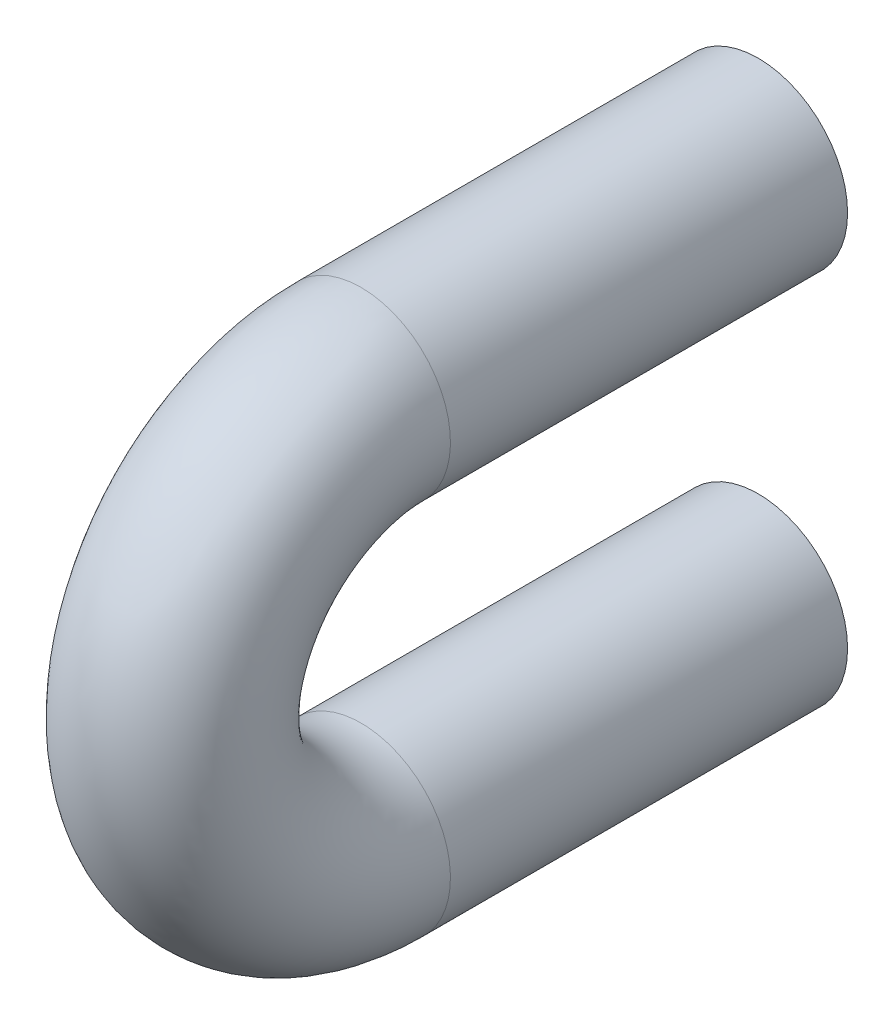
ISO-10303-21;
HEADER;
FILE_DESCRIPTION(('STEP AP214'),'2;1');
FILE_NAME('part.step','',(''),(''),'','','');
FILE_SCHEMA(('AUTOMOTIVE_DESIGN { 1 0 10303 214 1 1 1 1 }'));
ENDSEC;
DATA;
#1=APPLICATION_CONTEXT('core data for automotive mechanical design processes');
#2=APPLICATION_PROTOCOL_DEFINITION('international standard','automotive_design',2000,#1);
#3=PRODUCT_CONTEXT('',#1,'mechanical');
#4=PRODUCT('Part','Part','',(#3));
#5=PRODUCT_RELATED_PRODUCT_CATEGORY('part','',(#4));
#6=PRODUCT_DEFINITION_FORMATION('','',#4);
#7=PRODUCT_DEFINITION_CONTEXT('part definition',#1,'design');
#8=PRODUCT_DEFINITION('design','',#6,#7);
#9=PRODUCT_DEFINITION_SHAPE('','',#8);
#10=(LENGTH_UNIT() NAMED_UNIT(*) SI_UNIT(.MILLI.,.METRE.));
#11=(NAMED_UNIT(*) PLANE_ANGLE_UNIT() SI_UNIT($,.RADIAN.));
#12=(NAMED_UNIT(*) SI_UNIT($,.STERADIAN.) SOLID_ANGLE_UNIT());
#13=UNCERTAINTY_MEASURE_WITH_UNIT(LENGTH_MEASURE(1.E-05),#10,'distance_accuracy_value','');
#14=(GEOMETRIC_REPRESENTATION_CONTEXT(3) GLOBAL_UNCERTAINTY_ASSIGNED_CONTEXT((#13)) GLOBAL_UNIT_ASSIGNED_CONTEXT((#10,
#11,#12)) REPRESENTATION_CONTEXT('',''));
#15=CARTESIAN_POINT('',(0.,0.,0.));
#16=DIRECTION('',(0.,0.,1.));
#17=DIRECTION('',(1.,0.,0.));
#18=AXIS2_PLACEMENT_3D('',#15,#16,#17);
#19=CARTESIAN_POINT('',(0.,19.,20.));
#20=DIRECTION('',(0.,0.,-1.));
#21=DIRECTION('',(-1.,0.,0.));
#22=AXIS2_PLACEMENT_3D('',#19,#20,#21);
#23=CYLINDRICAL_SURFACE('',#22,4.5);
#24=CARTESIAN_POINT('',(0.,19.,20.));
#25=DIRECTION('',(0.,0.,-1.));
#26=DIRECTION('',(1.,0.,0.));
#27=AXIS2_PLACEMENT_3D('',#24,#25,#26);
#28=CIRCLE('',#27,4.5);
#29=CARTESIAN_POINT('',(0.,23.5,20.));
#30=VERTEX_POINT('',#29);
#31=EDGE_CURVE('E37',#30,#30,#28,.T.);
#32=ORIENTED_EDGE('',*,*,#31,.T.);
#33=EDGE_LOOP('',(#32));
#34=FACE_BOUND('',#33,.T.);
#35=CARTESIAN_POINT('',(0.,19.,0.));
#36=DIRECTION('',(0.,0.,-1.));
#37=DIRECTION('',(1.,0.,0.));
#38=AXIS2_PLACEMENT_3D('',#35,#36,#37);
#39=CIRCLE('',#38,4.5);
#40=CARTESIAN_POINT('',(4.5,19.,0.));
#41=VERTEX_POINT('',#40);
#42=EDGE_CURVE('E10',#41,#41,#39,.T.);
#43=ORIENTED_EDGE('',*,*,#42,.F.);
#44=EDGE_LOOP('',(#43));
#45=FACE_BOUND('',#44,.T.);
#46=ADVANCED_FACE('F31',(#34,#45),#23,.T.);
#47=CARTESIAN_POINT('',(0.,9.5,20.));
#48=DIRECTION('',(-1.,0.,0.));
#49=DIRECTION('',(0.,0.,1.));
#50=AXIS2_PLACEMENT_3D('',#47,#48,#49);
#51=TOROIDAL_SURFACE('',#50,9.5,4.5);
#52=CARTESIAN_POINT('',(0.,0.,20.));
#53=DIRECTION('',(0.,0.,1.));
#54=DIRECTION('',(1.,0.,0.));
#55=AXIS2_PLACEMENT_3D('',#52,#53,#54);
#56=CIRCLE('',#55,4.5);
#57=CARTESIAN_POINT('',(0.,-4.5,20.));
#58=VERTEX_POINT('',#57);
#59=EDGE_CURVE('E41',#58,#58,#56,.T.);
#60=CARTESIAN_POINT('',(0.,9.5,20.));
#61=DIRECTION('',(-1.,0.,0.));
#62=DIRECTION('',(0.,0.,1.));
#63=AXIS2_PLACEMENT_3D('',#60,#61,#62);
#64=CIRCLE('',#63,14.);
#65=EDGE_CURVE('',#58,#30,#64,.T.);
#66=ORIENTED_EDGE('',*,*,#59,.T.);
#67=ORIENTED_EDGE('',*,*,#31,.F.);
#68=ORIENTED_EDGE('',*,*,#65,.T.);
#69=ORIENTED_EDGE('',*,*,#65,.F.);
#70=EDGE_LOOP('',(#66,#68,#67,#69));
#71=FACE_BOUND('',#70,.T.);
#72=ADVANCED_FACE('F75',(#71),#51,.T.);
#73=CARTESIAN_POINT('',(0.,0.,20.));
#74=DIRECTION('',(0.,0.,-1.));
#75=DIRECTION('',(-1.,0.,0.));
#76=AXIS2_PLACEMENT_3D('',#73,#74,#75);
#77=CYLINDRICAL_SURFACE('',#76,4.5);
#78=ORIENTED_EDGE('',*,*,#59,.F.);
#79=EDGE_LOOP('',(#78));
#80=FACE_BOUND('',#79,.T.);
#81=CARTESIAN_POINT('',(0.,0.,0.));
#82=DIRECTION('',(0.,0.,1.));
#83=DIRECTION('',(1.,0.,0.));
#84=AXIS2_PLACEMENT_3D('',#81,#82,#83);
#85=CIRCLE('',#84,4.5);
#86=CARTESIAN_POINT('',(4.5,0.,0.));
#87=VERTEX_POINT('',#86);
#88=EDGE_CURVE('E45',#87,#87,#85,.T.);
#89=ORIENTED_EDGE('',*,*,#88,.T.);
#90=EDGE_LOOP('',(#89));
#91=FACE_BOUND('',#90,.T.);
#92=ADVANCED_FACE('F73',(#80,#91),#77,.T.);
#93=CARTESIAN_POINT('',(0.,19.,0.));
#94=DIRECTION('',(0.,0.,-1.));
#95=DIRECTION('',(1.,0.,0.));
#96=AXIS2_PLACEMENT_3D('',#93,#94,#95);
#97=PLANE('',#96);
#98=CARTESIAN_POINT('',(0.,19.,0.));
#99=DIRECTION('',(0.,0.,-1.));
#100=DIRECTION('',(0.,1.,0.));
#101=AXIS2_PLACEMENT_3D('',#98,#99,#100);
#102=CIRCLE('',#101,3.);
#103=CARTESIAN_POINT('',(0.,22.,0.));
#104=VERTEX_POINT('',#103);
#105=EDGE_CURVE('E53',#104,#104,#102,.T.);
#106=ORIENTED_EDGE('',*,*,#105,.F.);
#107=EDGE_LOOP('',(#106));
#108=FACE_BOUND('',#107,.T.);
#109=ORIENTED_EDGE('',*,*,#42,.T.);
#110=EDGE_LOOP('',(#109));
#111=FACE_BOUND('',#110,.T.);
#112=ADVANCED_FACE('F69',(#108,#111),#97,.T.);
#113=CARTESIAN_POINT('',(0.,0.,0.));
#114=DIRECTION('',(0.,0.,1.));
#115=DIRECTION('',(1.,0.,0.));
#116=AXIS2_PLACEMENT_3D('',#113,#114,#115);
#117=PLANE('',#116);
#118=CARTESIAN_POINT('',(0.,0.,0.));
#119=DIRECTION('',(0.,0.,-1.));
#120=DIRECTION('',(0.,1.,0.));
#121=AXIS2_PLACEMENT_3D('',#118,#119,#120);
#122=CIRCLE('',#121,3.);
#123=CARTESIAN_POINT('',(0.,3.,0.));
#124=VERTEX_POINT('',#123);
#125=EDGE_CURVE('E59',#124,#124,#122,.T.);
#126=ORIENTED_EDGE('',*,*,#125,.F.);
#127=EDGE_LOOP('',(#126));
#128=FACE_BOUND('',#127,.T.);
#129=ORIENTED_EDGE('',*,*,#88,.F.);
#130=EDGE_LOOP('',(#129));
#131=FACE_BOUND('',#130,.T.);
#132=ADVANCED_FACE('F65',(#128,#131),#117,.F.);
#133=CARTESIAN_POINT('',(0.,19.,18.));
#134=DIRECTION('',(0.,0.,-1.));
#135=DIRECTION('',(0.,1.,0.));
#136=AXIS2_PLACEMENT_3D('',#133,#134,#135);
#137=CYLINDRICAL_SURFACE('',#136,3.);
#138=CARTESIAN_POINT('',(0.,19.,18.));
#139=DIRECTION('',(0.,0.,-1.));
#140=DIRECTION('',(0.,1.,0.));
#141=AXIS2_PLACEMENT_3D('',#138,#139,#140);
#142=CIRCLE('',#141,3.);
#143=CARTESIAN_POINT('',(0.,22.,18.));
#144=VERTEX_POINT('',#143);
#145=EDGE_CURVE('E50',#144,#144,#142,.T.);
#146=ORIENTED_EDGE('',*,*,#145,.F.);
#147=EDGE_LOOP('',(#146));
#148=FACE_BOUND('',#147,.T.);
#149=ORIENTED_EDGE('',*,*,#105,.T.);
#150=EDGE_LOOP('',(#149));
#151=FACE_BOUND('',#150,.T.);
#152=ADVANCED_FACE('F68',(#148,#151),#137,.F.);
#153=CARTESIAN_POINT('',(0.,19.,18.));
#154=DIRECTION('',(0.,0.,-1.));
#155=DIRECTION('',(0.,1.,0.));
#156=AXIS2_PLACEMENT_3D('',#153,#154,#155);
#157=PLANE('',#156);
#158=ORIENTED_EDGE('',*,*,#145,.T.);
#159=EDGE_LOOP('',(#158));
#160=FACE_BOUND('',#159,.T.);
#161=ADVANCED_FACE('F119',(#160),#157,.T.);
#162=CARTESIAN_POINT('',(0.,0.,18.));
#163=DIRECTION('',(0.,0.,-1.));
#164=DIRECTION('',(0.,1.,0.));
#165=AXIS2_PLACEMENT_3D('',#162,#163,#164);
#166=CYLINDRICAL_SURFACE('',#165,3.);
#167=CARTESIAN_POINT('',(0.,0.,18.));
#168=DIRECTION('',(0.,0.,-1.));
#169=DIRECTION('',(0.,1.,0.));
#170=AXIS2_PLACEMENT_3D('',#167,#168,#169);
#171=CIRCLE('',#170,3.);
#172=CARTESIAN_POINT('',(0.,3.,18.));
#173=VERTEX_POINT('',#172);
#174=EDGE_CURVE('E56',#173,#173,#171,.T.);
#175=ORIENTED_EDGE('',*,*,#174,.F.);
#176=EDGE_LOOP('',(#175));
#177=FACE_BOUND('',#176,.T.);
#178=ORIENTED_EDGE('',*,*,#125,.T.);
#179=EDGE_LOOP('',(#178));
#180=FACE_BOUND('',#179,.T.);
#181=ADVANCED_FACE('F63',(#177,#180),#166,.F.);
#182=CARTESIAN_POINT('',(0.,0.,18.));
#183=DIRECTION('',(0.,0.,-1.));
#184=DIRECTION('',(0.,1.,0.));
#185=AXIS2_PLACEMENT_3D('',#182,#183,#184);
#186=PLANE('',#185);
#187=ORIENTED_EDGE('',*,*,#174,.T.);
#188=EDGE_LOOP('',(#187));
#189=FACE_BOUND('',#188,.T.);
#190=ADVANCED_FACE('F138',(#189),#186,.T.);
#191=CLOSED_SHELL('',(#46,#72,#92,#112,#132,#152,#161,#181,#190));
#192=MANIFOLD_SOLID_BREP('B2',#191);
#193=ADVANCED_BREP_SHAPE_REPRESENTATION('',(#18,#192),#14);
#194=SHAPE_DEFINITION_REPRESENTATION(#9,#193);
ENDSEC;
END-ISO-10303-21;
